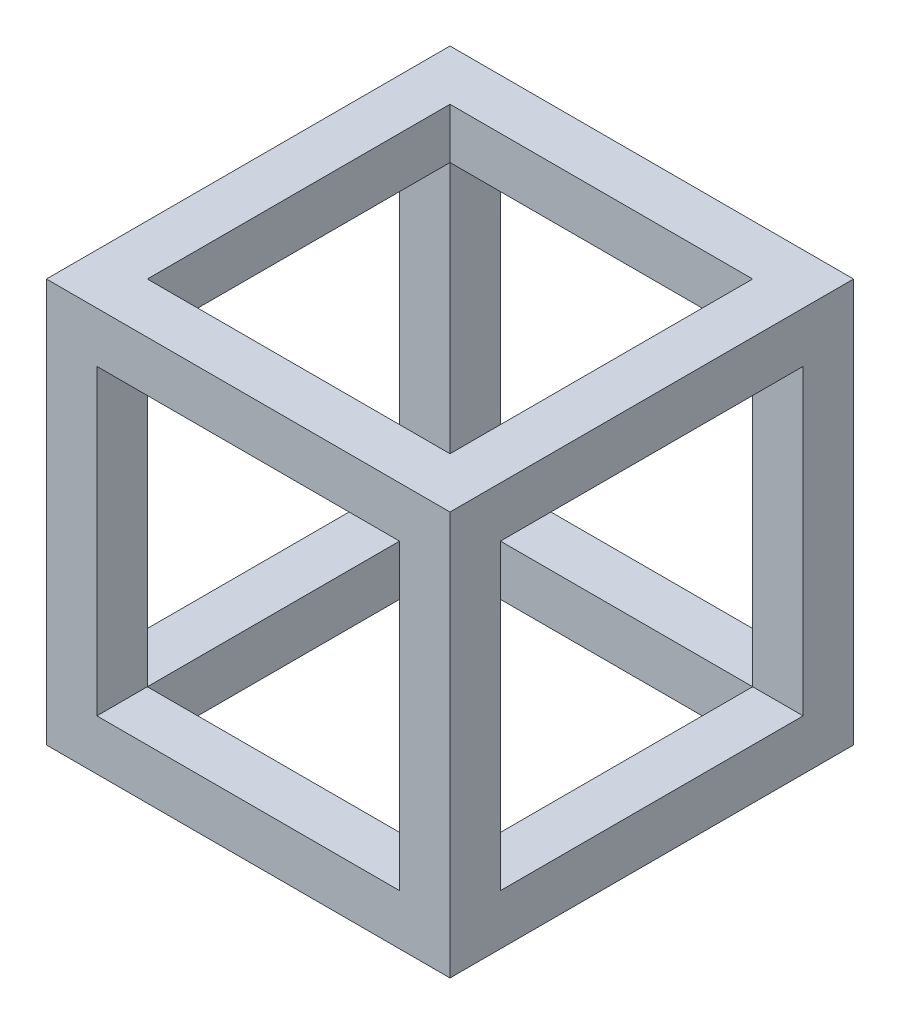
ISO-10303-21;
HEADER;
FILE_DESCRIPTION(('STEP AP214'),'2;1');
FILE_NAME('part.step','',(''),(''),'','','');
FILE_SCHEMA(('AUTOMOTIVE_DESIGN { 1 0 10303 214 1 1 1 1 }'));
ENDSEC;
DATA;
#1=APPLICATION_CONTEXT('core data for automotive mechanical design processes');
#2=APPLICATION_PROTOCOL_DEFINITION('international standard','automotive_design',2000,#1);
#3=PRODUCT_CONTEXT('',#1,'mechanical');
#4=PRODUCT('Part','Part','',(#3));
#5=PRODUCT_RELATED_PRODUCT_CATEGORY('part','',(#4));
#6=PRODUCT_DEFINITION_FORMATION('','',#4);
#7=PRODUCT_DEFINITION_CONTEXT('part definition',#1,'design');
#8=PRODUCT_DEFINITION('design','',#6,#7);
#9=PRODUCT_DEFINITION_SHAPE('','',#8);
#10=(LENGTH_UNIT() NAMED_UNIT(*) SI_UNIT(.MILLI.,.METRE.));
#11=(NAMED_UNIT(*) PLANE_ANGLE_UNIT() SI_UNIT($,.RADIAN.));
#12=(NAMED_UNIT(*) SI_UNIT($,.STERADIAN.) SOLID_ANGLE_UNIT());
#13=UNCERTAINTY_MEASURE_WITH_UNIT(LENGTH_MEASURE(1.E-05),#10,'distance_accuracy_value','');
#14=(GEOMETRIC_REPRESENTATION_CONTEXT(3) GLOBAL_UNCERTAINTY_ASSIGNED_CONTEXT((#13)) GLOBAL_UNIT_ASSIGNED_CONTEXT((#10,
#11,#12)) REPRESENTATION_CONTEXT('',''));
#15=CARTESIAN_POINT('',(0.,0.,0.));
#16=DIRECTION('',(0.,0.,1.));
#17=DIRECTION('',(1.,0.,0.));
#18=AXIS2_PLACEMENT_3D('',#15,#16,#17);
#19=CARTESIAN_POINT('',(0.,30.,0.));
#20=DIRECTION('',(0.,1.,0.));
#21=DIRECTION('',(-1.,0.,0.));
#22=AXIS2_PLACEMENT_3D('',#19,#20,#21);
#23=PLANE('',#22);
#24=DIRECTION('',(1.,0.,0.));
#25=VECTOR('',#24,1.);
#26=CARTESIAN_POINT('',(0.,30.,70.));
#27=LINE('',#26,#25);
#28=CARTESIAN_POINT('',(-40.,30.,70.));
#29=VERTEX_POINT('',#28);
#30=CARTESIAN_POINT('',(-30.,30.,70.));
#31=VERTEX_POINT('',#30);
#32=EDGE_CURVE('E97',#29,#31,#27,.T.);
#33=ORIENTED_EDGE('',*,*,#32,.F.);
#34=DIRECTION('',(0.,0.,1.));
#35=VECTOR('',#34,1.);
#36=CARTESIAN_POINT('',(-40.,30.,0.));
#37=LINE('',#36,#35);
#38=CARTESIAN_POINT('',(-40.,30.,10.));
#39=VERTEX_POINT('',#38);
#40=EDGE_CURVE('E288',#39,#29,#37,.T.);
#41=ORIENTED_EDGE('',*,*,#40,.F.);
#42=DIRECTION('',(1.,0.,0.));
#43=VECTOR('',#42,1.);
#44=CARTESIAN_POINT('',(0.,30.,10.));
#45=LINE('',#44,#43);
#46=CARTESIAN_POINT('',(-30.,30.,10.));
#47=VERTEX_POINT('',#46);
#48=EDGE_CURVE('E280',#39,#47,#45,.T.);
#49=ORIENTED_EDGE('',*,*,#48,.T.);
#50=DIRECTION('',(0.,0.,1.));
#51=VECTOR('',#50,1.);
#52=CARTESIAN_POINT('',(-30.,30.,0.));
#53=LINE('',#52,#51);
#54=EDGE_CURVE('E275',#47,#31,#53,.T.);
#55=ORIENTED_EDGE('',*,*,#54,.T.);
#56=EDGE_LOOP('',(#33,#41,#49,#55));
#57=FACE_BOUND('',#56,.T.);
#58=ADVANCED_FACE('F79',(#57),#23,.F.);
#59=DIRECTION('',(0.,0.,1.));
#60=VECTOR('',#59,1.);
#61=CARTESIAN_POINT('',(-30.,30.,70.));
#62=LINE('',#61,#60);
#63=CARTESIAN_POINT('',(-30.,30.,80.));
#64=VERTEX_POINT('',#63);
#65=EDGE_CURVE('E273',#31,#64,#62,.T.);
#66=ORIENTED_EDGE('',*,*,#65,.F.);
#67=DIRECTION('',(1.,0.,0.));
#68=VECTOR('',#67,1.);
#69=CARTESIAN_POINT('',(0.,30.,70.));
#70=LINE('',#69,#68);
#71=CARTESIAN_POINT('',(30.,30.,70.));
#72=VERTEX_POINT('',#71);
#73=EDGE_CURVE('E266',#31,#72,#70,.T.);
#74=ORIENTED_EDGE('',*,*,#73,.T.);
#75=DIRECTION('',(0.,0.,1.));
#76=VECTOR('',#75,1.);
#77=CARTESIAN_POINT('',(30.,30.,70.));
#78=LINE('',#77,#76);
#79=CARTESIAN_POINT('',(30.,30.,80.));
#80=VERTEX_POINT('',#79);
#81=EDGE_CURVE('E220',#72,#80,#78,.T.);
#82=ORIENTED_EDGE('',*,*,#81,.T.);
#83=DIRECTION('',(1.,0.,0.));
#84=VECTOR('',#83,1.);
#85=CARTESIAN_POINT('',(0.,30.,80.));
#86=LINE('',#85,#84);
#87=EDGE_CURVE('E276',#64,#80,#86,.T.);
#88=ORIENTED_EDGE('',*,*,#87,.F.);
#89=EDGE_LOOP('',(#66,#74,#82,#88));
#90=FACE_BOUND('',#89,.T.);
#91=ADVANCED_FACE('F271',(#90),#23,.F.);
#92=DIRECTION('',(1.,0.,0.));
#93=VECTOR('',#92,1.);
#94=CARTESIAN_POINT('',(0.,30.,70.));
#95=LINE('',#94,#93);
#96=CARTESIAN_POINT('',(40.,30.,70.));
#97=VERTEX_POINT('',#96);
#98=EDGE_CURVE('E105',#72,#97,#95,.T.);
#99=ORIENTED_EDGE('',*,*,#98,.F.);
#100=DIRECTION('',(0.,0.,1.));
#101=VECTOR('',#100,1.);
#102=CARTESIAN_POINT('',(30.,30.,0.));
#103=LINE('',#102,#101);
#104=CARTESIAN_POINT('',(30.,30.,10.));
#105=VERTEX_POINT('',#104);
#106=EDGE_CURVE('E245',#105,#72,#103,.T.);
#107=ORIENTED_EDGE('',*,*,#106,.F.);
#108=DIRECTION('',(1.,0.,0.));
#109=VECTOR('',#108,1.);
#110=CARTESIAN_POINT('',(0.,30.,10.));
#111=LINE('',#110,#109);
#112=CARTESIAN_POINT('',(40.,30.,10.));
#113=VERTEX_POINT('',#112);
#114=EDGE_CURVE('E259',#105,#113,#111,.T.);
#115=ORIENTED_EDGE('',*,*,#114,.T.);
#116=DIRECTION('',(0.,0.,-1.));
#117=VECTOR('',#116,1.);
#118=CARTESIAN_POINT('',(40.,30.,94.1421356237309));
#119=LINE('',#118,#117);
#120=EDGE_CURVE('E247',#97,#113,#119,.T.);
#121=ORIENTED_EDGE('',*,*,#120,.F.);
#122=EDGE_LOOP('',(#99,#107,#115,#121));
#123=FACE_BOUND('',#122,.T.);
#124=ADVANCED_FACE('F243',(#123),#23,.F.);
#125=CARTESIAN_POINT('',(0.,30.,80.));
#126=DIRECTION('',(0.,0.,1.));
#127=DIRECTION('',(1.,0.,0.));
#128=AXIS2_PLACEMENT_3D('',#125,#126,#127);
#129=PLANE('',#128);
#130=DIRECTION('',(0.,-1.,0.));
#131=VECTOR('',#130,1.);
#132=CARTESIAN_POINT('',(-30.,0.,80.));
#133=LINE('',#132,#131);
#134=CARTESIAN_POINT('',(-30.,-30.,80.));
#135=VERTEX_POINT('',#134);
#136=EDGE_CURVE('E249',#64,#135,#133,.T.);
#137=ORIENTED_EDGE('',*,*,#136,.F.);
#138=ORIENTED_EDGE('',*,*,#87,.T.);
#139=DIRECTION('',(0.,-1.,0.));
#140=VECTOR('',#139,1.);
#141=CARTESIAN_POINT('',(30.,0.,80.));
#142=LINE('',#141,#140);
#143=CARTESIAN_POINT('',(30.,-30.,80.));
#144=VERTEX_POINT('',#143);
#145=EDGE_CURVE('E225',#80,#144,#142,.T.);
#146=ORIENTED_EDGE('',*,*,#145,.T.);
#147=DIRECTION('',(-1.,0.,0.));
#148=VECTOR('',#147,1.);
#149=CARTESIAN_POINT('',(-40.,-30.,80.));
#150=LINE('',#149,#148);
#151=EDGE_CURVE('E405',#144,#135,#150,.T.);
#152=ORIENTED_EDGE('',*,*,#151,.T.);
#153=EDGE_LOOP('',(#137,#138,#146,#152));
#154=FACE_BOUND('',#153,.T.);
#155=DIRECTION('',(1.,0.,0.));
#156=VECTOR('',#155,1.);
#157=CARTESIAN_POINT('',(0.,40.,80.));
#158=LINE('',#157,#156);
#159=CARTESIAN_POINT('',(-40.,40.,80.));
#160=VERTEX_POINT('',#159);
#161=CARTESIAN_POINT('',(40.,40.,80.));
#162=VERTEX_POINT('',#161);
#163=EDGE_CURVE('E291',#160,#162,#158,.T.);
#164=ORIENTED_EDGE('',*,*,#163,.F.);
#165=DIRECTION('',(0.,1.,0.));
#166=VECTOR('',#165,1.);
#167=CARTESIAN_POINT('',(-40.,30.,80.));
#168=LINE('',#167,#166);
#169=CARTESIAN_POINT('',(-40.,-40.,80.));
#170=VERTEX_POINT('',#169);
#171=EDGE_CURVE('E12',#170,#160,#168,.T.);
#172=ORIENTED_EDGE('',*,*,#171,.F.);
#173=DIRECTION('',(-1.,0.,0.));
#174=VECTOR('',#173,1.);
#175=CARTESIAN_POINT('',(-40.,-40.,80.));
#176=LINE('',#175,#174);
#177=CARTESIAN_POINT('',(40.,-40.,80.));
#178=VERTEX_POINT('',#177);
#179=EDGE_CURVE('E391',#178,#170,#176,.T.);
#180=ORIENTED_EDGE('',*,*,#179,.F.);
#181=DIRECTION('',(0.,1.,0.));
#182=VECTOR('',#181,1.);
#183=CARTESIAN_POINT('',(40.,30.,80.));
#184=LINE('',#183,#182);
#185=EDGE_CURVE('E294',#178,#162,#184,.T.);
#186=ORIENTED_EDGE('',*,*,#185,.T.);
#187=EDGE_LOOP('',(#164,#172,#180,#186));
#188=FACE_BOUND('',#187,.T.);
#189=ADVANCED_FACE('F81',(#154,#188),#129,.T.);
#190=CARTESIAN_POINT('',(-40.,30.,0.));
#191=DIRECTION('',(-1.,0.,0.));
#192=DIRECTION('',(0.,-1.,0.));
#193=AXIS2_PLACEMENT_3D('',#190,#191,#192);
#194=PLANE('',#193);
#195=DIRECTION('',(0.,0.,1.));
#196=VECTOR('',#195,1.);
#197=CARTESIAN_POINT('',(-40.,40.,0.));
#198=LINE('',#197,#196);
#199=CARTESIAN_POINT('',(-40.,40.,0.));
#200=VERTEX_POINT('',#199);
#201=EDGE_CURVE('E282',#200,#160,#198,.T.);
#202=ORIENTED_EDGE('',*,*,#201,.F.);
#203=DIRECTION('',(0.,-1.,0.));
#204=VECTOR('',#203,1.);
#205=CARTESIAN_POINT('',(-40.,-40.,0.));
#206=LINE('',#205,#204);
#207=CARTESIAN_POINT('',(-40.,-40.,0.));
#208=VERTEX_POINT('',#207);
#209=EDGE_CURVE('E358',#200,#208,#206,.T.);
#210=ORIENTED_EDGE('',*,*,#209,.T.);
#211=DIRECTION('',(0.,0.,-1.));
#212=VECTOR('',#211,1.);
#213=CARTESIAN_POINT('',(-40.,-40.,10.));
#214=LINE('',#213,#212);
#215=EDGE_CURVE('E317',#170,#208,#214,.T.);
#216=ORIENTED_EDGE('',*,*,#215,.F.);
#217=ORIENTED_EDGE('',*,*,#171,.T.);
#218=EDGE_LOOP('',(#202,#210,#216,#217));
#219=FACE_BOUND('',#218,.T.);
#220=DIRECTION('',(0.,-1.,0.));
#221=VECTOR('',#220,1.);
#222=CARTESIAN_POINT('',(-40.,-40.,10.));
#223=LINE('',#222,#221);
#224=CARTESIAN_POINT('',(-40.,-30.,9.99999999999999));
#225=VERTEX_POINT('',#224);
#226=EDGE_CURVE('E354',#39,#225,#223,.T.);
#227=ORIENTED_EDGE('',*,*,#226,.F.);
#228=ORIENTED_EDGE('',*,*,#40,.T.);
#229=DIRECTION('',(0.,-1.,0.));
#230=VECTOR('',#229,1.);
#231=CARTESIAN_POINT('',(-40.,0.,70.));
#232=LINE('',#231,#230);
#233=CARTESIAN_POINT('',(-40.,-30.,70.));
#234=VERTEX_POINT('',#233);
#235=EDGE_CURVE('E466',#29,#234,#232,.T.);
#236=ORIENTED_EDGE('',*,*,#235,.T.);
#237=DIRECTION('',(0.,0.,-1.));
#238=VECTOR('',#237,1.);
#239=CARTESIAN_POINT('',(-40.,-30.,80.));
#240=LINE('',#239,#238);
#241=EDGE_CURVE('E393',#234,#225,#240,.T.);
#242=ORIENTED_EDGE('',*,*,#241,.T.);
#243=EDGE_LOOP('',(#227,#228,#236,#242));
#244=FACE_BOUND('',#243,.T.);
#245=ADVANCED_FACE('F464',(#219,#244),#194,.T.);
#246=CARTESIAN_POINT('',(-30.,30.,0.));
#247=DIRECTION('',(-1.,0.,0.));
#248=DIRECTION('',(0.,-1.,0.));
#249=AXIS2_PLACEMENT_3D('',#246,#247,#248);
#250=PLANE('',#249);
#251=DIRECTION('',(0.,0.,1.));
#252=VECTOR('',#251,1.);
#253=CARTESIAN_POINT('',(-30.,40.,0.));
#254=LINE('',#253,#252);
#255=CARTESIAN_POINT('',(-30.,40.,10.));
#256=VERTEX_POINT('',#255);
#257=CARTESIAN_POINT('',(-30.,40.,70.));
#258=VERTEX_POINT('',#257);
#259=EDGE_CURVE('E297',#256,#258,#254,.T.);
#260=ORIENTED_EDGE('',*,*,#259,.T.);
#261=DIRECTION('',(0.,1.,0.));
#262=VECTOR('',#261,1.);
#263=CARTESIAN_POINT('',(-30.,30.,70.));
#264=LINE('',#263,#262);
#265=EDGE_CURVE('E83',#31,#258,#264,.T.);
#266=ORIENTED_EDGE('',*,*,#265,.F.);
#267=ORIENTED_EDGE('',*,*,#54,.F.);
#268=DIRECTION('',(0.,1.,0.));
#269=VECTOR('',#268,1.);
#270=CARTESIAN_POINT('',(-30.,30.,10.));
#271=LINE('',#270,#269);
#272=EDGE_CURVE('E89',#47,#256,#271,.T.);
#273=ORIENTED_EDGE('',*,*,#272,.T.);
#274=EDGE_LOOP('',(#260,#266,#267,#273));
#275=FACE_BOUND('',#274,.T.);
#276=ADVANCED_FACE('F568',(#275),#250,.F.);
#277=CARTESIAN_POINT('',(0.,30.,70.));
#278=DIRECTION('',(0.,0.,1.));
#279=DIRECTION('',(1.,0.,0.));
#280=AXIS2_PLACEMENT_3D('',#277,#278,#279);
#281=PLANE('',#280);
#282=DIRECTION('',(1.,0.,0.));
#283=VECTOR('',#282,1.);
#284=CARTESIAN_POINT('',(0.,40.,70.));
#285=LINE('',#284,#283);
#286=CARTESIAN_POINT('',(30.,40.,70.));
#287=VERTEX_POINT('',#286);
#288=EDGE_CURVE('E268',#258,#287,#285,.T.);
#289=ORIENTED_EDGE('',*,*,#288,.T.);
#290=DIRECTION('',(0.,1.,0.));
#291=VECTOR('',#290,1.);
#292=CARTESIAN_POINT('',(30.,30.,70.));
#293=LINE('',#292,#291);
#294=EDGE_CURVE('E254',#72,#287,#293,.T.);
#295=ORIENTED_EDGE('',*,*,#294,.F.);
#296=ORIENTED_EDGE('',*,*,#73,.F.);
#297=ORIENTED_EDGE('',*,*,#265,.T.);
#298=EDGE_LOOP('',(#289,#295,#296,#297));
#299=FACE_BOUND('',#298,.T.);
#300=ADVANCED_FACE('F264',(#299),#281,.F.);
#301=CARTESIAN_POINT('',(0.,40.,0.));
#302=DIRECTION('',(0.,1.,0.));
#303=DIRECTION('',(-1.,0.,0.));
#304=AXIS2_PLACEMENT_3D('',#301,#302,#303);
#305=PLANE('',#304);
#306=ORIENTED_EDGE('',*,*,#259,.F.);
#307=DIRECTION('',(-1.,0.,0.));
#308=VECTOR('',#307,1.);
#309=CARTESIAN_POINT('',(40.,40.,10.));
#310=LINE('',#309,#308);
#311=CARTESIAN_POINT('',(30.,40.,10.));
#312=VERTEX_POINT('',#311);
#313=EDGE_CURVE('E315',#312,#256,#310,.T.);
#314=ORIENTED_EDGE('',*,*,#313,.F.);
#315=DIRECTION('',(0.,0.,1.));
#316=VECTOR('',#315,1.);
#317=CARTESIAN_POINT('',(30.,40.,0.));
#318=LINE('',#317,#316);
#319=EDGE_CURVE('E314',#312,#287,#318,.T.);
#320=ORIENTED_EDGE('',*,*,#319,.T.);
#321=ORIENTED_EDGE('',*,*,#288,.F.);
#322=EDGE_LOOP('',(#306,#314,#320,#321));
#323=FACE_BOUND('',#322,.T.);
#324=ORIENTED_EDGE('',*,*,#163,.T.);
#325=DIRECTION('',(0.,0.,-1.));
#326=VECTOR('',#325,1.);
#327=CARTESIAN_POINT('',(40.,40.,94.1421356237309));
#328=LINE('',#327,#326);
#329=CARTESIAN_POINT('',(40.,40.,0.));
#330=VERTEX_POINT('',#329);
#331=EDGE_CURVE('E330',#162,#330,#328,.T.);
#332=ORIENTED_EDGE('',*,*,#331,.T.);
#333=DIRECTION('',(-1.,0.,0.));
#334=VECTOR('',#333,1.);
#335=CARTESIAN_POINT('',(40.,40.,0.));
#336=LINE('',#335,#334);
#337=EDGE_CURVE('E371',#330,#200,#336,.T.);
#338=ORIENTED_EDGE('',*,*,#337,.T.);
#339=ORIENTED_EDGE('',*,*,#201,.T.);
#340=EDGE_LOOP('',(#324,#332,#338,#339));
#341=FACE_BOUND('',#340,.T.);
#342=ADVANCED_FACE('F311',(#323,#341),#305,.T.);
#343=CARTESIAN_POINT('',(40.,30.,94.1421356237309));
#344=DIRECTION('',(-1.,0.,0.));
#345=DIRECTION('',(0.,0.,1.));
#346=AXIS2_PLACEMENT_3D('',#343,#344,#345);
#347=PLANE('',#346);
#348=DIRECTION('',(0.,-1.,0.));
#349=VECTOR('',#348,1.);
#350=CARTESIAN_POINT('',(40.,0.,70.));
#351=LINE('',#350,#349);
#352=CARTESIAN_POINT('',(40.,-30.,70.));
#353=VERTEX_POINT('',#352);
#354=EDGE_CURVE('E231',#97,#353,#351,.T.);
#355=ORIENTED_EDGE('',*,*,#354,.F.);
#356=ORIENTED_EDGE('',*,*,#120,.T.);
#357=DIRECTION('',(0.,1.,0.));
#358=VECTOR('',#357,1.);
#359=CARTESIAN_POINT('',(40.,-40.,10.));
#360=LINE('',#359,#358);
#361=CARTESIAN_POINT('',(40.,-30.,9.99999999999999));
#362=VERTEX_POINT('',#361);
#363=EDGE_CURVE('E339',#362,#113,#360,.T.);
#364=ORIENTED_EDGE('',*,*,#363,.F.);
#365=DIRECTION('',(0.,0.,1.));
#366=VECTOR('',#365,1.);
#367=CARTESIAN_POINT('',(40.,-30.,80.));
#368=LINE('',#367,#366);
#369=EDGE_CURVE('E399',#362,#353,#368,.T.);
#370=ORIENTED_EDGE('',*,*,#369,.T.);
#371=EDGE_LOOP('',(#355,#356,#364,#370));
#372=FACE_BOUND('',#371,.T.);
#373=ORIENTED_EDGE('',*,*,#185,.F.);
#374=DIRECTION('',(0.,0.,-1.));
#375=VECTOR('',#374,1.);
#376=CARTESIAN_POINT('',(40.,-40.,10.));
#377=LINE('',#376,#375);
#378=CARTESIAN_POINT('',(40.,-40.,0.));
#379=VERTEX_POINT('',#378);
#380=EDGE_CURVE('E322',#178,#379,#377,.T.);
#381=ORIENTED_EDGE('',*,*,#380,.T.);
#382=DIRECTION('',(0.,1.,0.));
#383=VECTOR('',#382,1.);
#384=CARTESIAN_POINT('',(40.,-40.,0.));
#385=LINE('',#384,#383);
#386=EDGE_CURVE('E367',#379,#330,#385,.T.);
#387=ORIENTED_EDGE('',*,*,#386,.T.);
#388=ORIENTED_EDGE('',*,*,#331,.F.);
#389=EDGE_LOOP('',(#373,#381,#387,#388));
#390=FACE_BOUND('',#389,.T.);
#391=ADVANCED_FACE('F335',(#372,#390),#347,.F.);
#392=CARTESIAN_POINT('',(30.,30.,0.));
#393=DIRECTION('',(-1.,0.,0.));
#394=DIRECTION('',(0.,0.,1.));
#395=AXIS2_PLACEMENT_3D('',#392,#393,#394);
#396=PLANE('',#395);
#397=ORIENTED_EDGE('',*,*,#319,.F.);
#398=DIRECTION('',(0.,1.,0.));
#399=VECTOR('',#398,1.);
#400=CARTESIAN_POINT('',(30.,30.,10.));
#401=LINE('',#400,#399);
#402=EDGE_CURVE('E257',#105,#312,#401,.T.);
#403=ORIENTED_EDGE('',*,*,#402,.F.);
#404=ORIENTED_EDGE('',*,*,#106,.T.);
#405=ORIENTED_EDGE('',*,*,#294,.T.);
#406=EDGE_LOOP('',(#397,#403,#404,#405));
#407=FACE_BOUND('',#406,.T.);
#408=ADVANCED_FACE('F253',(#407),#396,.T.);
#409=CARTESIAN_POINT('',(0.,0.,10.));
#410=DIRECTION('',(0.,0.,1.));
#411=DIRECTION('',(1.,0.,0.));
#412=AXIS2_PLACEMENT_3D('',#409,#410,#411);
#413=PLANE('',#412);
#414=ORIENTED_EDGE('',*,*,#272,.F.);
#415=DIRECTION('',(-1.,0.,0.));
#416=VECTOR('',#415,1.);
#417=CARTESIAN_POINT('',(30.,30.,10.));
#418=LINE('',#417,#416);
#419=EDGE_CURVE('E419',#105,#47,#418,.T.);
#420=ORIENTED_EDGE('',*,*,#419,.F.);
#421=ORIENTED_EDGE('',*,*,#402,.T.);
#422=ORIENTED_EDGE('',*,*,#313,.T.);
#423=EDGE_LOOP('',(#414,#420,#421,#422));
#424=FACE_BOUND('',#423,.T.);
#425=ADVANCED_FACE('F585',(#424),#413,.T.);
#426=ORIENTED_EDGE('',*,*,#48,.F.);
#427=ORIENTED_EDGE('',*,*,#226,.T.);
#428=DIRECTION('',(1.,0.,0.));
#429=VECTOR('',#428,1.);
#430=CARTESIAN_POINT('',(0.,-30.,10.));
#431=LINE('',#430,#429);
#432=CARTESIAN_POINT('',(-30.,-30.,10.));
#433=VERTEX_POINT('',#432);
#434=EDGE_CURVE('E407',#225,#433,#431,.T.);
#435=ORIENTED_EDGE('',*,*,#434,.T.);
#436=DIRECTION('',(0.,-1.,0.));
#437=VECTOR('',#436,1.);
#438=CARTESIAN_POINT('',(-30.,-30.,10.));
#439=LINE('',#438,#437);
#440=EDGE_CURVE('E423',#47,#433,#439,.T.);
#441=ORIENTED_EDGE('',*,*,#440,.F.);
#442=EDGE_LOOP('',(#426,#427,#435,#441));
#443=FACE_BOUND('',#442,.T.);
#444=ADVANCED_FACE('F458',(#443),#413,.T.);
#445=ORIENTED_EDGE('',*,*,#114,.F.);
#446=DIRECTION('',(0.,1.,0.));
#447=VECTOR('',#446,1.);
#448=CARTESIAN_POINT('',(30.,-30.,10.));
#449=LINE('',#448,#447);
#450=CARTESIAN_POINT('',(30.,-30.,10.));
#451=VERTEX_POINT('',#450);
#452=EDGE_CURVE('E415',#451,#105,#449,.T.);
#453=ORIENTED_EDGE('',*,*,#452,.F.);
#454=EDGE_CURVE('E346',#451,#362,#431,.T.);
#455=ORIENTED_EDGE('',*,*,#454,.T.);
#456=ORIENTED_EDGE('',*,*,#363,.T.);
#457=EDGE_LOOP('',(#445,#453,#455,#456));
#458=FACE_BOUND('',#457,.T.);
#459=ADVANCED_FACE('F344',(#458),#413,.T.);
#460=CARTESIAN_POINT('',(0.,-30.,0.));
#461=DIRECTION('',(0.,-1.,0.));
#462=DIRECTION('',(0.,0.,-1.));
#463=AXIS2_PLACEMENT_3D('',#460,#461,#462);
#464=PLANE('',#463);
#465=DIRECTION('',(-1.,0.,0.));
#466=VECTOR('',#465,1.);
#467=CARTESIAN_POINT('',(0.,-30.,70.));
#468=LINE('',#467,#466);
#469=CARTESIAN_POINT('',(30.,-30.,70.));
#470=VERTEX_POINT('',#469);
#471=EDGE_CURVE('E235',#353,#470,#468,.T.);
#472=ORIENTED_EDGE('',*,*,#471,.F.);
#473=ORIENTED_EDGE('',*,*,#369,.F.);
#474=ORIENTED_EDGE('',*,*,#454,.F.);
#475=DIRECTION('',(0.,0.,1.));
#476=VECTOR('',#475,1.);
#477=CARTESIAN_POINT('',(30.,-30.,70.));
#478=LINE('',#477,#476);
#479=EDGE_CURVE('E479',#451,#470,#478,.T.);
#480=ORIENTED_EDGE('',*,*,#479,.T.);
#481=EDGE_LOOP('',(#472,#473,#474,#480));
#482=FACE_BOUND('',#481,.T.);
#483=ADVANCED_FACE('F615',(#482),#464,.F.);
#484=ORIENTED_EDGE('',*,*,#151,.F.);
#485=DIRECTION('',(0.,0.,1.));
#486=VECTOR('',#485,1.);
#487=CARTESIAN_POINT('',(30.,-30.,70.));
#488=LINE('',#487,#486);
#489=EDGE_CURVE('E230',#470,#144,#488,.T.);
#490=ORIENTED_EDGE('',*,*,#489,.F.);
#491=DIRECTION('',(-1.,0.,0.));
#492=VECTOR('',#491,1.);
#493=CARTESIAN_POINT('',(-30.,-30.,70.));
#494=LINE('',#493,#492);
#495=CARTESIAN_POINT('',(-30.,-30.,70.));
#496=VERTEX_POINT('',#495);
#497=EDGE_CURVE('E480',#470,#496,#494,.T.);
#498=ORIENTED_EDGE('',*,*,#497,.T.);
#499=DIRECTION('',(0.,0.,1.));
#500=VECTOR('',#499,1.);
#501=CARTESIAN_POINT('',(-30.,-30.,70.));
#502=LINE('',#501,#500);
#503=EDGE_CURVE('E518',#496,#135,#502,.T.);
#504=ORIENTED_EDGE('',*,*,#503,.T.);
#505=EDGE_LOOP('',(#484,#490,#498,#504));
#506=FACE_BOUND('',#505,.T.);
#507=ADVANCED_FACE('F515',(#506),#464,.F.);
#508=EDGE_CURVE('E473',#496,#234,#468,.T.);
#509=ORIENTED_EDGE('',*,*,#508,.F.);
#510=DIRECTION('',(0.,0.,-1.));
#511=VECTOR('',#510,1.);
#512=CARTESIAN_POINT('',(-30.,-30.,70.));
#513=LINE('',#512,#511);
#514=EDGE_CURVE('E472',#496,#433,#513,.T.);
#515=ORIENTED_EDGE('',*,*,#514,.T.);
#516=ORIENTED_EDGE('',*,*,#434,.F.);
#517=ORIENTED_EDGE('',*,*,#241,.F.);
#518=EDGE_LOOP('',(#509,#515,#516,#517));
#519=FACE_BOUND('',#518,.T.);
#520=ADVANCED_FACE('F470',(#519),#464,.F.);
#521=DIRECTION('',(1.,0.,0.));
#522=VECTOR('',#521,1.);
#523=CARTESIAN_POINT('',(40.,-40.,10.));
#524=LINE('',#523,#522);
#525=CARTESIAN_POINT('',(-30.,-40.,10.));
#526=VERTEX_POINT('',#525);
#527=CARTESIAN_POINT('',(30.,-40.,9.99999999999999));
#528=VERTEX_POINT('',#527);
#529=EDGE_CURVE('E348',#526,#528,#524,.T.);
#530=ORIENTED_EDGE('',*,*,#529,.T.);
#531=DIRECTION('',(0.,-1.,0.));
#532=VECTOR('',#531,1.);
#533=CARTESIAN_POINT('',(30.,-30.,9.99999999999999));
#534=LINE('',#533,#532);
#535=EDGE_CURVE('E401',#451,#528,#534,.T.);
#536=ORIENTED_EDGE('',*,*,#535,.F.);
#537=DIRECTION('',(1.,0.,0.));
#538=VECTOR('',#537,1.);
#539=CARTESIAN_POINT('',(30.,-30.,10.));
#540=LINE('',#539,#538);
#541=EDGE_CURVE('E411',#433,#451,#540,.T.);
#542=ORIENTED_EDGE('',*,*,#541,.F.);
#543=DIRECTION('',(0.,-1.,0.));
#544=VECTOR('',#543,1.);
#545=CARTESIAN_POINT('',(-30.,-30.,10.));
#546=LINE('',#545,#544);
#547=EDGE_CURVE('E502',#433,#526,#546,.T.);
#548=ORIENTED_EDGE('',*,*,#547,.T.);
#549=EDGE_LOOP('',(#530,#536,#542,#548));
#550=FACE_BOUND('',#549,.T.);
#551=ADVANCED_FACE('F594',(#550),#413,.T.);
#552=CARTESIAN_POINT('',(0.,0.,0.));
#553=DIRECTION('',(0.,0.,1.));
#554=DIRECTION('',(1.,0.,0.));
#555=AXIS2_PLACEMENT_3D('',#552,#553,#554);
#556=PLANE('',#555);
#557=DIRECTION('',(0.,-1.,0.));
#558=VECTOR('',#557,1.);
#559=CARTESIAN_POINT('',(-30.,-30.,0.));
#560=LINE('',#559,#558);
#561=CARTESIAN_POINT('',(-30.,30.,0.));
#562=VERTEX_POINT('',#561);
#563=CARTESIAN_POINT('',(-30.,-30.,0.));
#564=VERTEX_POINT('',#563);
#565=EDGE_CURVE('E416',#562,#564,#560,.T.);
#566=ORIENTED_EDGE('',*,*,#565,.T.);
#567=DIRECTION('',(1.,0.,0.));
#568=VECTOR('',#567,1.);
#569=CARTESIAN_POINT('',(30.,-30.,0.));
#570=LINE('',#569,#568);
#571=CARTESIAN_POINT('',(30.,-30.,0.));
#572=VERTEX_POINT('',#571);
#573=EDGE_CURVE('E428',#564,#572,#570,.T.);
#574=ORIENTED_EDGE('',*,*,#573,.T.);
#575=DIRECTION('',(0.,1.,0.));
#576=VECTOR('',#575,1.);
#577=CARTESIAN_POINT('',(30.,-30.,0.));
#578=LINE('',#577,#576);
#579=CARTESIAN_POINT('',(30.,30.,0.));
#580=VERTEX_POINT('',#579);
#581=EDGE_CURVE('E432',#572,#580,#578,.T.);
#582=ORIENTED_EDGE('',*,*,#581,.T.);
#583=DIRECTION('',(-1.,0.,0.));
#584=VECTOR('',#583,1.);
#585=CARTESIAN_POINT('',(30.,30.,0.));
#586=LINE('',#585,#584);
#587=EDGE_CURVE('E436',#580,#562,#586,.T.);
#588=ORIENTED_EDGE('',*,*,#587,.T.);
#589=EDGE_LOOP('',(#566,#574,#582,#588));
#590=FACE_BOUND('',#589,.T.);
#591=DIRECTION('',(1.,0.,0.));
#592=VECTOR('',#591,1.);
#593=CARTESIAN_POINT('',(40.,-40.,0.));
#594=LINE('',#593,#592);
#595=EDGE_CURVE('E362',#208,#379,#594,.T.);
#596=ORIENTED_EDGE('',*,*,#595,.F.);
#597=ORIENTED_EDGE('',*,*,#209,.F.);
#598=ORIENTED_EDGE('',*,*,#337,.F.);
#599=ORIENTED_EDGE('',*,*,#386,.F.);
#600=EDGE_LOOP('',(#596,#597,#598,#599));
#601=FACE_BOUND('',#600,.T.);
#602=ADVANCED_FACE('F388',(#590,#601),#556,.F.);
#603=CARTESIAN_POINT('',(40.,-40.,10.));
#604=DIRECTION('',(0.,1.,0.));
#605=DIRECTION('',(-1.,0.,0.));
#606=AXIS2_PLACEMENT_3D('',#603,#604,#605);
#607=PLANE('',#606);
#608=DIRECTION('',(0.,0.,-1.));
#609=VECTOR('',#608,1.);
#610=CARTESIAN_POINT('',(-30.,-40.,70.));
#611=LINE('',#610,#609);
#612=CARTESIAN_POINT('',(-30.,-40.,70.));
#613=VERTEX_POINT('',#612);
#614=EDGE_CURVE('E494',#613,#526,#611,.T.);
#615=ORIENTED_EDGE('',*,*,#614,.F.);
#616=DIRECTION('',(-1.,0.,0.));
#617=VECTOR('',#616,1.);
#618=CARTESIAN_POINT('',(-30.,-40.,70.));
#619=LINE('',#618,#617);
#620=CARTESIAN_POINT('',(30.,-40.,70.));
#621=VERTEX_POINT('',#620);
#622=EDGE_CURVE('E491',#621,#613,#619,.T.);
#623=ORIENTED_EDGE('',*,*,#622,.F.);
#624=DIRECTION('',(0.,0.,1.));
#625=VECTOR('',#624,1.);
#626=CARTESIAN_POINT('',(30.,-40.,70.));
#627=LINE('',#626,#625);
#628=EDGE_CURVE('E487',#528,#621,#627,.T.);
#629=ORIENTED_EDGE('',*,*,#628,.F.);
#630=ORIENTED_EDGE('',*,*,#529,.F.);
#631=EDGE_LOOP('',(#615,#623,#629,#630));
#632=FACE_BOUND('',#631,.T.);
#633=ORIENTED_EDGE('',*,*,#215,.T.);
#634=ORIENTED_EDGE('',*,*,#595,.T.);
#635=ORIENTED_EDGE('',*,*,#380,.F.);
#636=ORIENTED_EDGE('',*,*,#179,.T.);
#637=EDGE_LOOP('',(#633,#634,#635,#636));
#638=FACE_BOUND('',#637,.T.);
#639=ADVANCED_FACE('F384',(#632,#638),#607,.F.);
#640=CARTESIAN_POINT('',(30.,-30.,10.));
#641=DIRECTION('',(0.,1.,0.));
#642=DIRECTION('',(0.,0.,1.));
#643=AXIS2_PLACEMENT_3D('',#640,#641,#642);
#644=PLANE('',#643);
#645=ORIENTED_EDGE('',*,*,#573,.F.);
#646=DIRECTION('',(0.,0.,-1.));
#647=VECTOR('',#646,1.);
#648=CARTESIAN_POINT('',(-30.,-30.,10.));
#649=LINE('',#648,#647);
#650=EDGE_CURVE('E427',#433,#564,#649,.T.);
#651=ORIENTED_EDGE('',*,*,#650,.F.);
#652=ORIENTED_EDGE('',*,*,#541,.T.);
#653=DIRECTION('',(0.,0.,-1.));
#654=VECTOR('',#653,1.);
#655=CARTESIAN_POINT('',(30.,-30.,10.));
#656=LINE('',#655,#654);
#657=EDGE_CURVE('E363',#451,#572,#656,.T.);
#658=ORIENTED_EDGE('',*,*,#657,.T.);
#659=EDGE_LOOP('',(#645,#651,#652,#658));
#660=FACE_BOUND('',#659,.T.);
#661=ADVANCED_FACE('F590',(#660),#644,.T.);
#662=CARTESIAN_POINT('',(30.,-30.,10.));
#663=DIRECTION('',(-1.,0.,0.));
#664=DIRECTION('',(0.,0.,1.));
#665=AXIS2_PLACEMENT_3D('',#662,#663,#664);
#666=PLANE('',#665);
#667=ORIENTED_EDGE('',*,*,#581,.F.);
#668=ORIENTED_EDGE('',*,*,#657,.F.);
#669=ORIENTED_EDGE('',*,*,#452,.T.);
#670=DIRECTION('',(0.,0.,-1.));
#671=VECTOR('',#670,1.);
#672=CARTESIAN_POINT('',(30.,30.,10.));
#673=LINE('',#672,#671);
#674=EDGE_CURVE('E449',#105,#580,#673,.T.);
#675=ORIENTED_EDGE('',*,*,#674,.T.);
#676=EDGE_LOOP('',(#667,#668,#669,#675));
#677=FACE_BOUND('',#676,.T.);
#678=ADVANCED_FACE('F601',(#677),#666,.T.);
#679=CARTESIAN_POINT('',(30.,30.,10.));
#680=DIRECTION('',(0.,-1.,0.));
#681=DIRECTION('',(0.,0.,-1.));
#682=AXIS2_PLACEMENT_3D('',#679,#680,#681);
#683=PLANE('',#682);
#684=ORIENTED_EDGE('',*,*,#587,.F.);
#685=ORIENTED_EDGE('',*,*,#674,.F.);
#686=ORIENTED_EDGE('',*,*,#419,.T.);
#687=DIRECTION('',(0.,0.,-1.));
#688=VECTOR('',#687,1.);
#689=CARTESIAN_POINT('',(-30.,30.,10.));
#690=LINE('',#689,#688);
#691=EDGE_CURVE('E446',#47,#562,#690,.T.);
#692=ORIENTED_EDGE('',*,*,#691,.T.);
#693=EDGE_LOOP('',(#684,#685,#686,#692));
#694=FACE_BOUND('',#693,.T.);
#695=ADVANCED_FACE('F605',(#694),#683,.T.);
#696=CARTESIAN_POINT('',(-30.,-30.,10.));
#697=DIRECTION('',(1.,0.,0.));
#698=DIRECTION('',(0.,0.,-1.));
#699=AXIS2_PLACEMENT_3D('',#696,#697,#698);
#700=PLANE('',#699);
#701=ORIENTED_EDGE('',*,*,#565,.F.);
#702=ORIENTED_EDGE('',*,*,#691,.F.);
#703=ORIENTED_EDGE('',*,*,#440,.T.);
#704=ORIENTED_EDGE('',*,*,#650,.T.);
#705=EDGE_LOOP('',(#701,#702,#703,#704));
#706=FACE_BOUND('',#705,.T.);
#707=ADVANCED_FACE('F609',(#706),#700,.T.);
#708=CARTESIAN_POINT('',(-30.,-30.,70.));
#709=DIRECTION('',(0.,0.,1.));
#710=DIRECTION('',(1.,0.,0.));
#711=AXIS2_PLACEMENT_3D('',#708,#709,#710);
#712=PLANE('',#711);
#713=ORIENTED_EDGE('',*,*,#622,.T.);
#714=DIRECTION('',(0.,-1.,0.));
#715=VECTOR('',#714,1.);
#716=CARTESIAN_POINT('',(-30.,-30.,70.));
#717=LINE('',#716,#715);
#718=EDGE_CURVE('E485',#496,#613,#717,.T.);
#719=ORIENTED_EDGE('',*,*,#718,.F.);
#720=ORIENTED_EDGE('',*,*,#497,.F.);
#721=DIRECTION('',(0.,-1.,0.));
#722=VECTOR('',#721,1.);
#723=CARTESIAN_POINT('',(30.,-30.,70.));
#724=LINE('',#723,#722);
#725=EDGE_CURVE('E394',#470,#621,#724,.T.);
#726=ORIENTED_EDGE('',*,*,#725,.T.);
#727=EDGE_LOOP('',(#713,#719,#720,#726));
#728=FACE_BOUND('',#727,.T.);
#729=ADVANCED_FACE('F613',(#728),#712,.F.);
#730=CARTESIAN_POINT('',(30.,-30.,70.));
#731=DIRECTION('',(1.,0.,0.));
#732=DIRECTION('',(0.,0.,-1.));
#733=AXIS2_PLACEMENT_3D('',#730,#731,#732);
#734=PLANE('',#733);
#735=ORIENTED_EDGE('',*,*,#628,.T.);
#736=ORIENTED_EDGE('',*,*,#725,.F.);
#737=ORIENTED_EDGE('',*,*,#479,.F.);
#738=ORIENTED_EDGE('',*,*,#535,.T.);
#739=EDGE_LOOP('',(#735,#736,#737,#738));
#740=FACE_BOUND('',#739,.T.);
#741=ADVANCED_FACE('F621',(#740),#734,.F.);
#742=CARTESIAN_POINT('',(-30.,-30.,70.));
#743=DIRECTION('',(-1.,0.,0.));
#744=DIRECTION('',(0.,0.,1.));
#745=AXIS2_PLACEMENT_3D('',#742,#743,#744);
#746=PLANE('',#745);
#747=ORIENTED_EDGE('',*,*,#614,.T.);
#748=ORIENTED_EDGE('',*,*,#547,.F.);
#749=ORIENTED_EDGE('',*,*,#514,.F.);
#750=ORIENTED_EDGE('',*,*,#718,.T.);
#751=EDGE_LOOP('',(#747,#748,#749,#750));
#752=FACE_BOUND('',#751,.T.);
#753=ADVANCED_FACE('F552',(#752),#746,.F.);
#754=CARTESIAN_POINT('',(0.,0.,70.));
#755=DIRECTION('',(0.,0.,1.));
#756=DIRECTION('',(1.,0.,0.));
#757=AXIS2_PLACEMENT_3D('',#754,#755,#756);
#758=PLANE('',#757);
#759=DIRECTION('',(0.,-1.,0.));
#760=VECTOR('',#759,1.);
#761=CARTESIAN_POINT('',(-30.,0.,70.));
#762=LINE('',#761,#760);
#763=EDGE_CURVE('E237',#31,#496,#762,.T.);
#764=ORIENTED_EDGE('',*,*,#763,.T.);
#765=ORIENTED_EDGE('',*,*,#508,.T.);
#766=ORIENTED_EDGE('',*,*,#235,.F.);
#767=ORIENTED_EDGE('',*,*,#32,.T.);
#768=EDGE_LOOP('',(#764,#765,#766,#767));
#769=FACE_BOUND('',#768,.T.);
#770=ADVANCED_FACE('F532',(#769),#758,.F.);
#771=CARTESIAN_POINT('',(-30.,0.,70.));
#772=DIRECTION('',(-1.,0.,0.));
#773=DIRECTION('',(0.,0.,1.));
#774=AXIS2_PLACEMENT_3D('',#771,#772,#773);
#775=PLANE('',#774);
#776=ORIENTED_EDGE('',*,*,#136,.T.);
#777=ORIENTED_EDGE('',*,*,#503,.F.);
#778=ORIENTED_EDGE('',*,*,#763,.F.);
#779=ORIENTED_EDGE('',*,*,#65,.T.);
#780=EDGE_LOOP('',(#776,#777,#778,#779));
#781=FACE_BOUND('',#780,.T.);
#782=ADVANCED_FACE('F544',(#781),#775,.F.);
#783=ORIENTED_EDGE('',*,*,#354,.T.);
#784=ORIENTED_EDGE('',*,*,#471,.T.);
#785=DIRECTION('',(0.,-1.,0.));
#786=VECTOR('',#785,1.);
#787=CARTESIAN_POINT('',(30.,0.,70.));
#788=LINE('',#787,#786);
#789=EDGE_CURVE('E223',#72,#470,#788,.T.);
#790=ORIENTED_EDGE('',*,*,#789,.F.);
#791=ORIENTED_EDGE('',*,*,#98,.T.);
#792=EDGE_LOOP('',(#783,#784,#790,#791));
#793=FACE_BOUND('',#792,.T.);
#794=ADVANCED_FACE('F233',(#793),#758,.F.);
#795=CARTESIAN_POINT('',(30.,0.,70.));
#796=DIRECTION('',(-1.,0.,0.));
#797=DIRECTION('',(0.,0.,1.));
#798=AXIS2_PLACEMENT_3D('',#795,#796,#797);
#799=PLANE('',#798);
#800=ORIENTED_EDGE('',*,*,#145,.F.);
#801=ORIENTED_EDGE('',*,*,#81,.F.);
#802=ORIENTED_EDGE('',*,*,#789,.T.);
#803=ORIENTED_EDGE('',*,*,#489,.T.);
#804=EDGE_LOOP('',(#800,#801,#802,#803));
#805=FACE_BOUND('',#804,.T.);
#806=ADVANCED_FACE('F221',(#805),#799,.T.);
#807=CLOSED_SHELL('',(#58,#91,#124,#189,#245,#276,#300,#342,#391,#408,#425,#444,#459,#483,#507,
#520,#551,#602,#639,#661,#678,#695,#707,#729,#741,#753,#770,#782,#794,#806));
#808=MANIFOLD_SOLID_BREP('B2',#807);
#809=ADVANCED_BREP_SHAPE_REPRESENTATION('',(#18,#808),#14);
#810=SHAPE_DEFINITION_REPRESENTATION(#9,#809);
ENDSEC;
END-ISO-10303-21;
